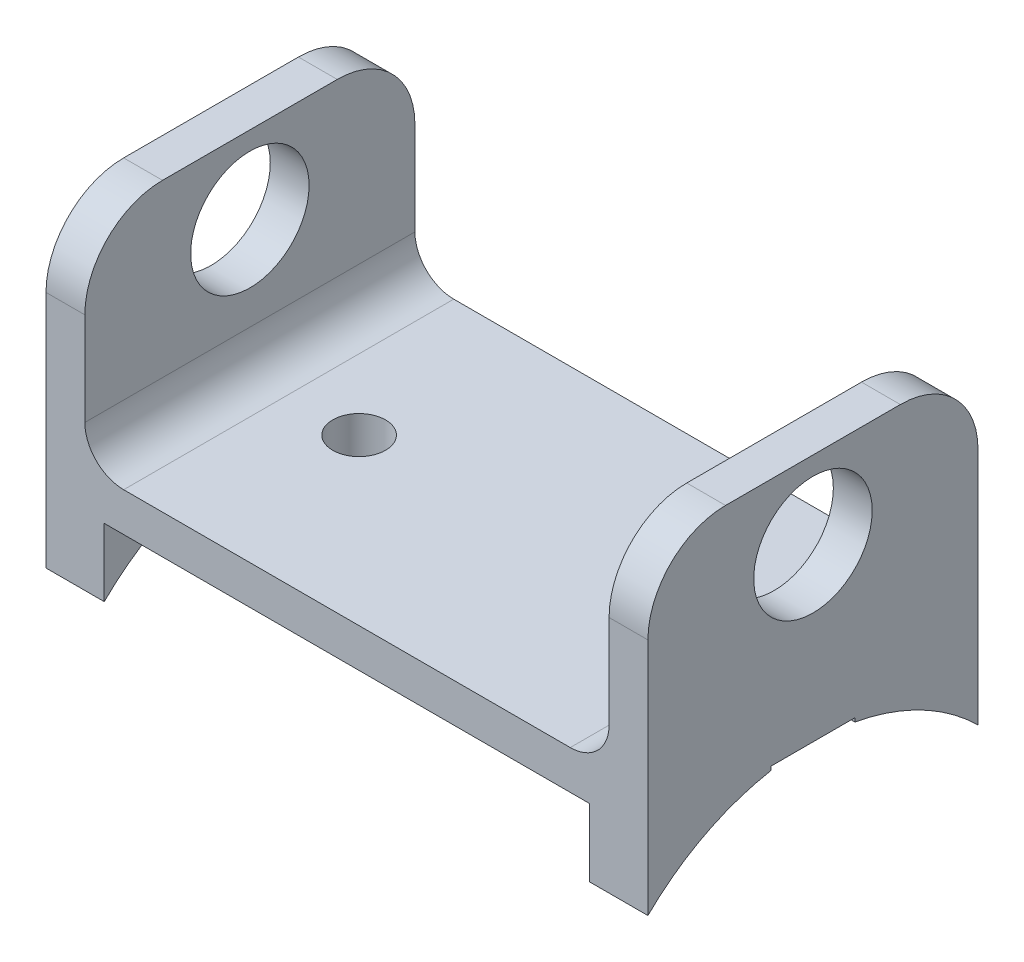
ISO-10303-21;
HEADER;
FILE_DESCRIPTION(('STEP AP214'),'2;1');
FILE_NAME('part.step','',(''),(''),'','','');
FILE_SCHEMA(('AUTOMOTIVE_DESIGN { 1 0 10303 214 1 1 1 1 }'));
ENDSEC;
DATA;
#1=APPLICATION_CONTEXT('core data for automotive mechanical design processes');
#2=APPLICATION_PROTOCOL_DEFINITION('international standard','automotive_design',2000,#1);
#3=PRODUCT_CONTEXT('',#1,'mechanical');
#4=PRODUCT('Part','Part','',(#3));
#5=PRODUCT_RELATED_PRODUCT_CATEGORY('part','',(#4));
#6=PRODUCT_DEFINITION_FORMATION('','',#4);
#7=PRODUCT_DEFINITION_CONTEXT('part definition',#1,'design');
#8=PRODUCT_DEFINITION('design','',#6,#7);
#9=PRODUCT_DEFINITION_SHAPE('','',#8);
#10=(LENGTH_UNIT() NAMED_UNIT(*) SI_UNIT(.MILLI.,.METRE.));
#11=(NAMED_UNIT(*) PLANE_ANGLE_UNIT() SI_UNIT($,.RADIAN.));
#12=(NAMED_UNIT(*) SI_UNIT($,.STERADIAN.) SOLID_ANGLE_UNIT());
#13=UNCERTAINTY_MEASURE_WITH_UNIT(LENGTH_MEASURE(1.E-05),#10,'distance_accuracy_value','');
#14=(GEOMETRIC_REPRESENTATION_CONTEXT(3) GLOBAL_UNCERTAINTY_ASSIGNED_CONTEXT((#13)) GLOBAL_UNIT_ASSIGNED_CONTEXT((#10,
#11,#12)) REPRESENTATION_CONTEXT('',''));
#15=CARTESIAN_POINT('',(0.,0.,0.));
#16=DIRECTION('',(0.,0.,1.));
#17=DIRECTION('',(1.,0.,0.));
#18=AXIS2_PLACEMENT_3D('',#15,#16,#17);
#19=CARTESIAN_POINT('',(-17.145,0.,-10.795));
#20=DIRECTION('',(0.,1.,0.));
#21=DIRECTION('',(0.,0.,1.));
#22=AXIS2_PLACEMENT_3D('',#19,#20,#21);
#23=PLANE('',#22);
#24=CARTESIAN_POINT('',(10.,0.,1.37910516340156E-13));
#25=DIRECTION('',(0.,1.,0.));
#26=DIRECTION('',(0.,0.,1.));
#27=AXIS2_PLACEMENT_3D('',#24,#25,#26);
#28=CIRCLE('',#27,1.7272);
#29=CARTESIAN_POINT('',(10.,0.,1.72720000000014));
#30=VERTEX_POINT('',#29);
#31=EDGE_CURVE('E428',#30,#30,#28,.T.);
#32=ORIENTED_EDGE('',*,*,#31,.T.);
#33=EDGE_LOOP('',(#32));
#34=FACE_BOUND('',#33,.T.);
#35=CARTESIAN_POINT('',(-10.,0.,1.40078920685127E-13));
#36=DIRECTION('',(0.,1.,0.));
#37=DIRECTION('',(0.,0.,1.));
#38=AXIS2_PLACEMENT_3D('',#35,#36,#37);
#39=CIRCLE('',#38,1.7272);
#40=CARTESIAN_POINT('',(-10.,0.,1.72720000000014));
#41=VERTEX_POINT('',#40);
#42=EDGE_CURVE('E437',#41,#41,#39,.T.);
#43=ORIENTED_EDGE('',*,*,#42,.T.);
#44=EDGE_LOOP('',(#43));
#45=FACE_BOUND('',#44,.T.);
#46=DIRECTION('',(1.,0.,0.));
#47=VECTOR('',#46,1.);
#48=CARTESIAN_POINT('',(15.875,0.,-2.74999999999998));
#49=LINE('',#48,#47);
#50=CARTESIAN_POINT('',(15.875,0.,-2.74999999999998));
#51=VERTEX_POINT('',#50);
#52=CARTESIAN_POINT('',(19.685,0.,-2.74999999999998));
#53=VERTEX_POINT('',#52);
#54=EDGE_CURVE('E228',#51,#53,#49,.T.);
#55=ORIENTED_EDGE('',*,*,#54,.T.);
#56=DIRECTION('',(0.,0.,-1.));
#57=VECTOR('',#56,1.);
#58=CARTESIAN_POINT('',(19.685,0.,10.795));
#59=LINE('',#58,#57);
#60=CARTESIAN_POINT('',(19.685,0.,2.74999999999998));
#61=VERTEX_POINT('',#60);
#62=EDGE_CURVE('E423',#61,#53,#59,.T.);
#63=ORIENTED_EDGE('',*,*,#62,.F.);
#64=DIRECTION('',(1.,0.,0.));
#65=VECTOR('',#64,1.);
#66=CARTESIAN_POINT('',(15.875,0.,2.74999999999998));
#67=LINE('',#66,#65);
#68=CARTESIAN_POINT('',(15.875,0.,2.74999999999998));
#69=VERTEX_POINT('',#68);
#70=EDGE_CURVE('E267',#69,#61,#67,.T.);
#71=ORIENTED_EDGE('',*,*,#70,.F.);
#72=DIRECTION('',(0.,0.,1.));
#73=VECTOR('',#72,1.);
#74=CARTESIAN_POINT('',(15.875,0.,10.795));
#75=LINE('',#74,#73);
#76=CARTESIAN_POINT('',(15.875,0.,10.795));
#77=VERTEX_POINT('',#76);
#78=EDGE_CURVE('E253',#69,#77,#75,.T.);
#79=ORIENTED_EDGE('',*,*,#78,.T.);
#80=DIRECTION('',(1.,0.,0.));
#81=VECTOR('',#80,1.);
#82=CARTESIAN_POINT('',(17.145,0.,10.795));
#83=LINE('',#82,#81);
#84=CARTESIAN_POINT('',(-15.875,0.,10.795));
#85=VERTEX_POINT('',#84);
#86=EDGE_CURVE('E442',#85,#77,#83,.T.);
#87=ORIENTED_EDGE('',*,*,#86,.F.);
#88=DIRECTION('',(0.,0.,1.));
#89=VECTOR('',#88,1.);
#90=CARTESIAN_POINT('',(-15.875,0.,10.795));
#91=LINE('',#90,#89);
#92=CARTESIAN_POINT('',(-15.875,0.,2.74999999999998));
#93=VERTEX_POINT('',#92);
#94=EDGE_CURVE('E277',#93,#85,#91,.T.);
#95=ORIENTED_EDGE('',*,*,#94,.F.);
#96=DIRECTION('',(-1.,0.,0.));
#97=VECTOR('',#96,1.);
#98=CARTESIAN_POINT('',(-15.875,0.,2.74999999999998));
#99=LINE('',#98,#97);
#100=CARTESIAN_POINT('',(-19.685,0.,2.74999999999998));
#101=VERTEX_POINT('',#100);
#102=EDGE_CURVE('E292',#93,#101,#99,.T.);
#103=ORIENTED_EDGE('',*,*,#102,.T.);
#104=DIRECTION('',(0.,0.,-1.));
#105=VECTOR('',#104,1.);
#106=CARTESIAN_POINT('',(-19.685,0.,10.795));
#107=LINE('',#106,#105);
#108=CARTESIAN_POINT('',(-19.685,0.,-2.74999999999998));
#109=VERTEX_POINT('',#108);
#110=EDGE_CURVE('E326',#101,#109,#107,.T.);
#111=ORIENTED_EDGE('',*,*,#110,.T.);
#112=DIRECTION('',(-1.,0.,0.));
#113=VECTOR('',#112,1.);
#114=CARTESIAN_POINT('',(-15.875,0.,-2.74999999999998));
#115=LINE('',#114,#113);
#116=CARTESIAN_POINT('',(-15.875,0.,-2.74999999999998));
#117=VERTEX_POINT('',#116);
#118=EDGE_CURVE('E315',#117,#109,#115,.T.);
#119=ORIENTED_EDGE('',*,*,#118,.F.);
#120=DIRECTION('',(0.,0.,-1.));
#121=VECTOR('',#120,1.);
#122=CARTESIAN_POINT('',(-15.875,0.,-10.795));
#123=LINE('',#122,#121);
#124=CARTESIAN_POINT('',(-15.875,0.,-10.795));
#125=VERTEX_POINT('',#124);
#126=EDGE_CURVE('E304',#117,#125,#123,.T.);
#127=ORIENTED_EDGE('',*,*,#126,.T.);
#128=DIRECTION('',(-1.,0.,0.));
#129=VECTOR('',#128,1.);
#130=CARTESIAN_POINT('',(17.145,0.,-10.795));
#131=LINE('',#130,#129);
#132=CARTESIAN_POINT('',(15.875,0.,-10.795));
#133=VERTEX_POINT('',#132);
#134=EDGE_CURVE('E331',#133,#125,#131,.T.);
#135=ORIENTED_EDGE('',*,*,#134,.F.);
#136=DIRECTION('',(0.,0.,-1.));
#137=VECTOR('',#136,1.);
#138=CARTESIAN_POINT('',(15.875,0.,-10.795));
#139=LINE('',#138,#137);
#140=EDGE_CURVE('E216',#51,#133,#139,.T.);
#141=ORIENTED_EDGE('',*,*,#140,.F.);
#142=EDGE_LOOP('',(#55,#63,#71,#79,#87,#95,#103,#111,#119,#127,#135,#141));
#143=FACE_BOUND('',#142,.T.);
#144=ADVANCED_FACE('F37',(#34,#45,#143),#23,.F.);
#145=CARTESIAN_POINT('',(-17.145,2.54,-10.795));
#146=DIRECTION('',(0.,1.,0.));
#147=DIRECTION('',(0.,0.,1.));
#148=AXIS2_PLACEMENT_3D('',#145,#146,#147);
#149=PLANE('',#148);
#150=CARTESIAN_POINT('',(-10.,2.54,1.40078920685127E-13));
#151=DIRECTION('',(0.,1.,0.));
#152=DIRECTION('',(0.,0.,1.));
#153=AXIS2_PLACEMENT_3D('',#150,#151,#152);
#154=CIRCLE('',#153,1.7272);
#155=CARTESIAN_POINT('',(-10.,2.54,1.72720000000014));
#156=VERTEX_POINT('',#155);
#157=EDGE_CURVE('E439',#156,#156,#154,.T.);
#158=ORIENTED_EDGE('',*,*,#157,.F.);
#159=EDGE_LOOP('',(#158));
#160=FACE_BOUND('',#159,.T.);
#161=DIRECTION('',(-1.,0.,0.));
#162=VECTOR('',#161,1.);
#163=CARTESIAN_POINT('',(17.145,2.54,-10.795));
#164=LINE('',#163,#162);
#165=CARTESIAN_POINT('',(14.605,2.54,-10.795));
#166=VERTEX_POINT('',#165);
#167=CARTESIAN_POINT('',(-14.605,2.54,-10.795));
#168=VERTEX_POINT('',#167);
#169=EDGE_CURVE('E391',#166,#168,#164,.T.);
#170=ORIENTED_EDGE('',*,*,#169,.T.);
#171=DIRECTION('',(0.,0.,1.));
#172=VECTOR('',#171,1.);
#173=CARTESIAN_POINT('',(-14.605,2.54,10.795));
#174=LINE('',#173,#172);
#175=CARTESIAN_POINT('',(-14.605,2.54,10.795));
#176=VERTEX_POINT('',#175);
#177=EDGE_CURVE('E403',#168,#176,#174,.T.);
#178=ORIENTED_EDGE('',*,*,#177,.T.);
#179=DIRECTION('',(1.,0.,0.));
#180=VECTOR('',#179,1.);
#181=CARTESIAN_POINT('',(17.145,2.54,10.795));
#182=LINE('',#181,#180);
#183=CARTESIAN_POINT('',(14.605,2.54,10.795));
#184=VERTEX_POINT('',#183);
#185=EDGE_CURVE('E408',#176,#184,#182,.T.);
#186=ORIENTED_EDGE('',*,*,#185,.T.);
#187=DIRECTION('',(0.,0.,-1.));
#188=VECTOR('',#187,1.);
#189=CARTESIAN_POINT('',(14.605,2.54,-10.795));
#190=LINE('',#189,#188);
#191=EDGE_CURVE('E406',#184,#166,#190,.T.);
#192=ORIENTED_EDGE('',*,*,#191,.T.);
#193=EDGE_LOOP('',(#170,#178,#186,#192));
#194=FACE_BOUND('',#193,.T.);
#195=CARTESIAN_POINT('',(10.,2.54,1.37910516340156E-13));
#196=DIRECTION('',(0.,1.,0.));
#197=DIRECTION('',(0.,0.,1.));
#198=AXIS2_PLACEMENT_3D('',#195,#196,#197);
#199=CIRCLE('',#198,1.7272);
#200=CARTESIAN_POINT('',(10.,2.54,1.72720000000014));
#201=VERTEX_POINT('',#200);
#202=EDGE_CURVE('E432',#201,#201,#199,.T.);
#203=ORIENTED_EDGE('',*,*,#202,.F.);
#204=EDGE_LOOP('',(#203));
#205=FACE_BOUND('',#204,.T.);
#206=ADVANCED_FACE('F400',(#160,#194,#205),#149,.T.);
#207=CARTESIAN_POINT('',(17.145,2.54,10.795));
#208=DIRECTION('',(0.,0.,-1.));
#209=DIRECTION('',(-1.,0.,0.));
#210=AXIS2_PLACEMENT_3D('',#207,#208,#209);
#211=PLANE('',#210);
#212=DIRECTION('',(0.,-1.,0.));
#213=VECTOR('',#212,1.);
#214=CARTESIAN_POINT('',(-17.145,0.,10.795));
#215=LINE('',#214,#213);
#216=CARTESIAN_POINT('',(-17.145,11.176,10.795));
#217=VERTEX_POINT('',#216);
#218=CARTESIAN_POINT('',(-17.145,5.08,10.795));
#219=VERTEX_POINT('',#218);
#220=EDGE_CURVE('E343',#217,#219,#215,.T.);
#221=ORIENTED_EDGE('',*,*,#220,.F.);
#222=DIRECTION('',(1.,0.,0.));
#223=VECTOR('',#222,1.);
#224=CARTESIAN_POINT('',(-19.685,11.176,10.795));
#225=LINE('',#224,#223);
#226=CARTESIAN_POINT('',(-19.685,11.176,10.795));
#227=VERTEX_POINT('',#226);
#228=EDGE_CURVE('E504',#217,#227,#225,.F.);
#229=ORIENTED_EDGE('',*,*,#228,.T.);
#230=DIRECTION('',(0.,-1.,0.));
#231=VECTOR('',#230,1.);
#232=CARTESIAN_POINT('',(-19.685,0.,10.795));
#233=LINE('',#232,#231);
#234=CARTESIAN_POINT('',(-19.685,-4.4371417584576,10.795));
#235=VERTEX_POINT('',#234);
#236=EDGE_CURVE('E414',#227,#235,#233,.T.);
#237=ORIENTED_EDGE('',*,*,#236,.T.);
#238=DIRECTION('',(-1.,0.,0.));
#239=VECTOR('',#238,1.);
#240=CARTESIAN_POINT('',(-15.875,-4.4371417584576,10.795));
#241=LINE('',#240,#239);
#242=CARTESIAN_POINT('',(-15.875,-4.4371417584576,10.795));
#243=VERTEX_POINT('',#242);
#244=EDGE_CURVE('E283',#243,#235,#241,.T.);
#245=ORIENTED_EDGE('',*,*,#244,.F.);
#246=DIRECTION('',(0.,-1.,0.));
#247=VECTOR('',#246,1.);
#248=CARTESIAN_POINT('',(-15.875,0.,10.795));
#249=LINE('',#248,#247);
#250=EDGE_CURVE('E274',#85,#243,#249,.T.);
#251=ORIENTED_EDGE('',*,*,#250,.F.);
#252=ORIENTED_EDGE('',*,*,#86,.T.);
#253=DIRECTION('',(0.,-1.,0.));
#254=VECTOR('',#253,1.);
#255=CARTESIAN_POINT('',(15.875,0.,10.795));
#256=LINE('',#255,#254);
#257=CARTESIAN_POINT('',(15.875,-4.4371417584576,10.795));
#258=VERTEX_POINT('',#257);
#259=EDGE_CURVE('E256',#77,#258,#256,.T.);
#260=ORIENTED_EDGE('',*,*,#259,.T.);
#261=DIRECTION('',(1.,0.,0.));
#262=VECTOR('',#261,1.);
#263=CARTESIAN_POINT('',(15.875,-4.4371417584576,10.795));
#264=LINE('',#263,#262);
#265=CARTESIAN_POINT('',(19.685,-4.4371417584576,10.795));
#266=VERTEX_POINT('',#265);
#267=EDGE_CURVE('E263',#258,#266,#264,.T.);
#268=ORIENTED_EDGE('',*,*,#267,.T.);
#269=DIRECTION('',(0.,-1.,0.));
#270=VECTOR('',#269,1.);
#271=CARTESIAN_POINT('',(19.685,0.,10.795));
#272=LINE('',#271,#270);
#273=CARTESIAN_POINT('',(19.685,11.176,10.795));
#274=VERTEX_POINT('',#273);
#275=EDGE_CURVE('E421',#274,#266,#272,.T.);
#276=ORIENTED_EDGE('',*,*,#275,.F.);
#277=DIRECTION('',(-1.,0.,0.));
#278=VECTOR('',#277,1.);
#279=CARTESIAN_POINT('',(17.145,11.176,10.795));
#280=LINE('',#279,#278);
#281=CARTESIAN_POINT('',(17.145,11.176,10.795));
#282=VERTEX_POINT('',#281);
#283=EDGE_CURVE('E363',#274,#282,#280,.T.);
#284=ORIENTED_EDGE('',*,*,#283,.T.);
#285=DIRECTION('',(0.,-1.,0.));
#286=VECTOR('',#285,1.);
#287=CARTESIAN_POINT('',(17.145,0.,10.795));
#288=LINE('',#287,#286);
#289=CARTESIAN_POINT('',(17.145,5.08,10.795));
#290=VERTEX_POINT('',#289);
#291=EDGE_CURVE('E364',#282,#290,#288,.T.);
#292=ORIENTED_EDGE('',*,*,#291,.T.);
#293=CARTESIAN_POINT('',(14.605,5.08,10.795));
#294=DIRECTION('',(0.,0.,-1.));
#295=DIRECTION('',(-1.,0.,0.));
#296=AXIS2_PLACEMENT_3D('',#293,#294,#295);
#297=CIRCLE('',#296,2.54);
#298=EDGE_CURVE('E12',#290,#184,#297,.T.);
#299=ORIENTED_EDGE('',*,*,#298,.T.);
#300=ORIENTED_EDGE('',*,*,#185,.F.);
#301=CARTESIAN_POINT('',(-14.605,5.08,10.795));
#302=DIRECTION('',(0.,0.,-1.));
#303=DIRECTION('',(-1.,0.,0.));
#304=AXIS2_PLACEMENT_3D('',#301,#302,#303);
#305=CIRCLE('',#304,2.54);
#306=EDGE_CURVE('E385',#176,#219,#305,.T.);
#307=ORIENTED_EDGE('',*,*,#306,.T.);
#308=EDGE_LOOP('',(#221,#229,#237,#245,#251,#252,#260,#268,#276,#284,#292,#299,#300,#307));
#309=FACE_BOUND('',#308,.T.);
#310=ADVANCED_FACE('F512',(#309),#211,.F.);
#311=CARTESIAN_POINT('',(17.145,2.54,-10.795));
#312=DIRECTION('',(0.,0.,1.));
#313=DIRECTION('',(1.,0.,0.));
#314=AXIS2_PLACEMENT_3D('',#311,#312,#313);
#315=PLANE('',#314);
#316=DIRECTION('',(0.,1.,0.));
#317=VECTOR('',#316,1.);
#318=CARTESIAN_POINT('',(-19.685,0.,-10.795));
#319=LINE('',#318,#317);
#320=CARTESIAN_POINT('',(-19.685,-4.4371417584576,-10.795));
#321=VERTEX_POINT('',#320);
#322=CARTESIAN_POINT('',(-19.685,11.176,-10.795));
#323=VERTEX_POINT('',#322);
#324=EDGE_CURVE('E330',#321,#323,#319,.T.);
#325=ORIENTED_EDGE('',*,*,#324,.T.);
#326=DIRECTION('',(1.,0.,0.));
#327=VECTOR('',#326,1.);
#328=CARTESIAN_POINT('',(-17.145,11.176,-10.795));
#329=LINE('',#328,#327);
#330=CARTESIAN_POINT('',(-17.145,11.176,-10.795));
#331=VERTEX_POINT('',#330);
#332=EDGE_CURVE('E348',#323,#331,#329,.T.);
#333=ORIENTED_EDGE('',*,*,#332,.T.);
#334=DIRECTION('',(0.,1.,0.));
#335=VECTOR('',#334,1.);
#336=CARTESIAN_POINT('',(-17.145,0.,-10.795));
#337=LINE('',#336,#335);
#338=CARTESIAN_POINT('',(-17.145,5.08,-10.795));
#339=VERTEX_POINT('',#338);
#340=EDGE_CURVE('E393',#339,#331,#337,.T.);
#341=ORIENTED_EDGE('',*,*,#340,.F.);
#342=CARTESIAN_POINT('',(-14.605,5.08,-10.795));
#343=DIRECTION('',(0.,0.,1.));
#344=DIRECTION('',(1.,0.,0.));
#345=AXIS2_PLACEMENT_3D('',#342,#343,#344);
#346=CIRCLE('',#345,2.54);
#347=EDGE_CURVE('E387',#339,#168,#346,.T.);
#348=ORIENTED_EDGE('',*,*,#347,.T.);
#349=ORIENTED_EDGE('',*,*,#169,.F.);
#350=CARTESIAN_POINT('',(14.605,5.08,-10.795));
#351=DIRECTION('',(0.,0.,1.));
#352=DIRECTION('',(1.,0.,0.));
#353=AXIS2_PLACEMENT_3D('',#350,#351,#352);
#354=CIRCLE('',#353,2.54);
#355=CARTESIAN_POINT('',(17.145,5.08,-10.795));
#356=VERTEX_POINT('',#355);
#357=EDGE_CURVE('E45',#166,#356,#354,.T.);
#358=ORIENTED_EDGE('',*,*,#357,.T.);
#359=DIRECTION('',(0.,1.,0.));
#360=VECTOR('',#359,1.);
#361=CARTESIAN_POINT('',(17.145,0.,-10.795));
#362=LINE('',#361,#360);
#363=CARTESIAN_POINT('',(17.145,11.176,-10.795));
#364=VERTEX_POINT('',#363);
#365=EDGE_CURVE('E367',#356,#364,#362,.T.);
#366=ORIENTED_EDGE('',*,*,#365,.T.);
#367=DIRECTION('',(-1.,0.,0.));
#368=VECTOR('',#367,1.);
#369=CARTESIAN_POINT('',(17.145,11.176,-10.795));
#370=LINE('',#369,#368);
#371=CARTESIAN_POINT('',(19.685,11.176,-10.795));
#372=VERTEX_POINT('',#371);
#373=EDGE_CURVE('E407',#364,#372,#370,.F.);
#374=ORIENTED_EDGE('',*,*,#373,.T.);
#375=DIRECTION('',(0.,1.,0.));
#376=VECTOR('',#375,1.);
#377=CARTESIAN_POINT('',(19.685,0.,-10.795));
#378=LINE('',#377,#376);
#379=CARTESIAN_POINT('',(19.685,-4.4371417584576,-10.795));
#380=VERTEX_POINT('',#379);
#381=EDGE_CURVE('E224',#380,#372,#378,.T.);
#382=ORIENTED_EDGE('',*,*,#381,.F.);
#383=DIRECTION('',(1.,0.,0.));
#384=VECTOR('',#383,1.);
#385=CARTESIAN_POINT('',(15.875,-4.4371417584576,-10.795));
#386=LINE('',#385,#384);
#387=CARTESIAN_POINT('',(15.875,-4.4371417584576,-10.795));
#388=VERTEX_POINT('',#387);
#389=EDGE_CURVE('E220',#388,#380,#386,.T.);
#390=ORIENTED_EDGE('',*,*,#389,.F.);
#391=DIRECTION('',(0.,-1.,0.));
#392=VECTOR('',#391,1.);
#393=CARTESIAN_POINT('',(15.875,0.,-10.795));
#394=LINE('',#393,#392);
#395=EDGE_CURVE('E209',#133,#388,#394,.T.);
#396=ORIENTED_EDGE('',*,*,#395,.F.);
#397=ORIENTED_EDGE('',*,*,#134,.T.);
#398=DIRECTION('',(0.,-1.,0.));
#399=VECTOR('',#398,1.);
#400=CARTESIAN_POINT('',(-15.875,0.,-10.795));
#401=LINE('',#400,#399);
#402=CARTESIAN_POINT('',(-15.875,-4.4371417584576,-10.795));
#403=VERTEX_POINT('',#402);
#404=EDGE_CURVE('E312',#125,#403,#401,.T.);
#405=ORIENTED_EDGE('',*,*,#404,.T.);
#406=DIRECTION('',(-1.,0.,0.));
#407=VECTOR('',#406,1.);
#408=CARTESIAN_POINT('',(-15.875,-4.4371417584576,-10.795));
#409=LINE('',#408,#407);
#410=EDGE_CURVE('E318',#403,#321,#409,.T.);
#411=ORIENTED_EDGE('',*,*,#410,.T.);
#412=EDGE_LOOP('',(#325,#333,#341,#348,#349,#358,#366,#374,#382,#390,#396,#397,#405,#411));
#413=FACE_BOUND('',#412,.T.);
#414=ADVANCED_FACE('F222',(#413),#315,.F.);
#415=CARTESIAN_POINT('',(-10.,2.54,1.40078920685127E-13));
#416=DIRECTION('',(0.,-1.,0.));
#417=DIRECTION('',(0.,0.,-1.));
#418=AXIS2_PLACEMENT_3D('',#415,#416,#417);
#419=CYLINDRICAL_SURFACE('',#418,1.7272);
#420=ORIENTED_EDGE('',*,*,#157,.T.);
#421=EDGE_LOOP('',(#420));
#422=FACE_BOUND('',#421,.T.);
#423=ORIENTED_EDGE('',*,*,#42,.F.);
#424=EDGE_LOOP('',(#423));
#425=FACE_BOUND('',#424,.T.);
#426=ADVANCED_FACE('F558',(#422,#425),#419,.F.);
#427=CARTESIAN_POINT('',(10.,2.54,1.37910516340156E-13));
#428=DIRECTION('',(0.,-1.,0.));
#429=DIRECTION('',(0.,0.,-1.));
#430=AXIS2_PLACEMENT_3D('',#427,#428,#429);
#431=CYLINDRICAL_SURFACE('',#430,1.7272);
#432=ORIENTED_EDGE('',*,*,#202,.T.);
#433=EDGE_LOOP('',(#432));
#434=FACE_BOUND('',#433,.T.);
#435=ORIENTED_EDGE('',*,*,#31,.F.);
#436=EDGE_LOOP('',(#435));
#437=FACE_BOUND('',#436,.T.);
#438=ADVANCED_FACE('F637',(#434,#437),#431,.F.);
#439=CARTESIAN_POINT('',(17.145,16.256,10.795));
#440=DIRECTION('',(-1.,0.,0.));
#441=DIRECTION('',(0.,0.,1.));
#442=AXIS2_PLACEMENT_3D('',#439,#440,#441);
#443=PLANE('',#442);
#444=CARTESIAN_POINT('',(17.145,11.176,0.));
#445=DIRECTION('',(1.,0.,0.));
#446=DIRECTION('',(0.,0.,-1.));
#447=AXIS2_PLACEMENT_3D('',#444,#445,#446);
#448=CIRCLE('',#447,3.8735);
#449=CARTESIAN_POINT('',(17.145,11.176,-3.8735));
#450=VERTEX_POINT('',#449);
#451=EDGE_CURVE('E329',#450,#450,#448,.T.);
#452=ORIENTED_EDGE('',*,*,#451,.T.);
#453=EDGE_LOOP('',(#452));
#454=FACE_BOUND('',#453,.T.);
#455=ORIENTED_EDGE('',*,*,#365,.F.);
#456=DIRECTION('',(0.,0.,-1.));
#457=VECTOR('',#456,1.);
#458=CARTESIAN_POINT('',(17.145,5.08,10.795));
#459=LINE('',#458,#457);
#460=EDGE_CURVE('E58',#356,#290,#459,.F.);
#461=ORIENTED_EDGE('',*,*,#460,.T.);
#462=ORIENTED_EDGE('',*,*,#291,.F.);
#463=CARTESIAN_POINT('',(17.145,11.176,5.715));
#464=DIRECTION('',(-1.,0.,0.));
#465=DIRECTION('',(0.,0.,1.));
#466=AXIS2_PLACEMENT_3D('',#463,#464,#465);
#467=CIRCLE('',#466,5.08);
#468=CARTESIAN_POINT('',(17.145,16.256,5.715));
#469=VERTEX_POINT('',#468);
#470=EDGE_CURVE('E502',#282,#469,#467,.T.);
#471=ORIENTED_EDGE('',*,*,#470,.T.);
#472=DIRECTION('',(0.,0.,1.));
#473=VECTOR('',#472,1.);
#474=CARTESIAN_POINT('',(17.145,16.256,10.795));
#475=LINE('',#474,#473);
#476=CARTESIAN_POINT('',(17.145,16.256,-5.715));
#477=VERTEX_POINT('',#476);
#478=EDGE_CURVE('E377',#477,#469,#475,.T.);
#479=ORIENTED_EDGE('',*,*,#478,.F.);
#480=CARTESIAN_POINT('',(17.145,11.176,-5.715));
#481=DIRECTION('',(-1.,0.,0.));
#482=DIRECTION('',(0.,0.,1.));
#483=AXIS2_PLACEMENT_3D('',#480,#481,#482);
#484=CIRCLE('',#483,5.08);
#485=EDGE_CURVE('E492',#477,#364,#484,.T.);
#486=ORIENTED_EDGE('',*,*,#485,.T.);
#487=EDGE_LOOP('',(#455,#461,#462,#471,#479,#486));
#488=FACE_BOUND('',#487,.T.);
#489=ADVANCED_FACE('F515',(#454,#488),#443,.T.);
#490=CARTESIAN_POINT('',(19.685,16.256,10.795));
#491=DIRECTION('',(-1.,0.,0.));
#492=DIRECTION('',(0.,0.,1.));
#493=AXIS2_PLACEMENT_3D('',#490,#491,#492);
#494=PLANE('',#493);
#495=DIRECTION('',(0.,0.,1.));
#496=VECTOR('',#495,1.);
#497=CARTESIAN_POINT('',(19.685,16.256,10.795));
#498=LINE('',#497,#496);
#499=CARTESIAN_POINT('',(19.685,16.256,-5.715));
#500=VERTEX_POINT('',#499);
#501=CARTESIAN_POINT('',(19.685,16.256,5.715));
#502=VERTEX_POINT('',#501);
#503=EDGE_CURVE('E373',#500,#502,#498,.T.);
#504=ORIENTED_EDGE('',*,*,#503,.T.);
#505=CARTESIAN_POINT('',(19.685,11.176,5.715));
#506=DIRECTION('',(-1.,0.,0.));
#507=DIRECTION('',(0.,0.,1.));
#508=AXIS2_PLACEMENT_3D('',#505,#506,#507);
#509=CIRCLE('',#508,5.08);
#510=EDGE_CURVE('E412',#502,#274,#509,.F.);
#511=ORIENTED_EDGE('',*,*,#510,.T.);
#512=ORIENTED_EDGE('',*,*,#275,.T.);
#513=CARTESIAN_POINT('',(19.685,-15.35,0.));
#514=DIRECTION('',(-1.,0.,0.));
#515=DIRECTION('',(0.,0.,-1.));
#516=AXIS2_PLACEMENT_3D('',#513,#514,#515);
#517=CIRCLE('',#516,15.35);
#518=CARTESIAN_POINT('',(19.685,-0.248344461616135,2.74999999999999));
#519=VERTEX_POINT('',#518);
#520=EDGE_CURVE('E243',#266,#519,#517,.T.);
#521=ORIENTED_EDGE('',*,*,#520,.T.);
#522=DIRECTION('',(0.,1.,0.));
#523=VECTOR('',#522,1.);
#524=CARTESIAN_POINT('',(19.685,-0.248344461616135,2.74999999999999));
#525=LINE('',#524,#523);
#526=EDGE_CURVE('E250',#519,#61,#525,.T.);
#527=ORIENTED_EDGE('',*,*,#526,.T.);
#528=ORIENTED_EDGE('',*,*,#62,.T.);
#529=DIRECTION('',(0.,1.,0.));
#530=VECTOR('',#529,1.);
#531=CARTESIAN_POINT('',(19.685,-0.248344461616135,-2.74999999999999));
#532=LINE('',#531,#530);
#533=CARTESIAN_POINT('',(19.685,-0.248344461616135,-2.74999999999999));
#534=VERTEX_POINT('',#533);
#535=EDGE_CURVE('E234',#534,#53,#532,.T.);
#536=ORIENTED_EDGE('',*,*,#535,.F.);
#537=CARTESIAN_POINT('',(19.685,-15.35,0.));
#538=DIRECTION('',(1.,0.,0.));
#539=DIRECTION('',(0.,0.,1.));
#540=AXIS2_PLACEMENT_3D('',#537,#538,#539);
#541=CIRCLE('',#540,15.35);
#542=EDGE_CURVE('E236',#380,#534,#541,.T.);
#543=ORIENTED_EDGE('',*,*,#542,.F.);
#544=ORIENTED_EDGE('',*,*,#381,.T.);
#545=CARTESIAN_POINT('',(19.685,11.176,-5.715));
#546=DIRECTION('',(-1.,0.,0.));
#547=DIRECTION('',(0.,0.,1.));
#548=AXIS2_PLACEMENT_3D('',#545,#546,#547);
#549=CIRCLE('',#548,5.08);
#550=EDGE_CURVE('E494',#372,#500,#549,.F.);
#551=ORIENTED_EDGE('',*,*,#550,.T.);
#552=EDGE_LOOP('',(#504,#511,#512,#521,#527,#528,#536,#543,#544,#551));
#553=FACE_BOUND('',#552,.T.);
#554=CARTESIAN_POINT('',(19.685,11.176,0.));
#555=DIRECTION('',(1.,0.,0.));
#556=DIRECTION('',(0.,0.,-1.));
#557=AXIS2_PLACEMENT_3D('',#554,#555,#556);
#558=CIRCLE('',#557,3.8735);
#559=CARTESIAN_POINT('',(19.685,11.176,-3.8735));
#560=VERTEX_POINT('',#559);
#561=EDGE_CURVE('E368',#560,#560,#558,.T.);
#562=ORIENTED_EDGE('',*,*,#561,.F.);
#563=EDGE_LOOP('',(#562));
#564=FACE_BOUND('',#563,.T.);
#565=ADVANCED_FACE('F522',(#553,#564),#494,.F.);
#566=CARTESIAN_POINT('',(19.685,16.256,10.795));
#567=DIRECTION('',(0.,-1.,0.));
#568=DIRECTION('',(0.,0.,-1.));
#569=AXIS2_PLACEMENT_3D('',#566,#567,#568);
#570=PLANE('',#569);
#571=ORIENTED_EDGE('',*,*,#478,.T.);
#572=DIRECTION('',(-1.,0.,0.));
#573=VECTOR('',#572,1.);
#574=CARTESIAN_POINT('',(19.685,16.256,5.715));
#575=LINE('',#574,#573);
#576=EDGE_CURVE('E496',#469,#502,#575,.F.);
#577=ORIENTED_EDGE('',*,*,#576,.T.);
#578=ORIENTED_EDGE('',*,*,#503,.F.);
#579=DIRECTION('',(-1.,0.,0.));
#580=VECTOR('',#579,1.);
#581=CARTESIAN_POINT('',(19.685,16.256,-5.715));
#582=LINE('',#581,#580);
#583=EDGE_CURVE('E495',#500,#477,#582,.T.);
#584=ORIENTED_EDGE('',*,*,#583,.T.);
#585=EDGE_LOOP('',(#571,#577,#578,#584));
#586=FACE_BOUND('',#585,.T.);
#587=ADVANCED_FACE('F520',(#586),#570,.F.);
#588=CARTESIAN_POINT('',(19.685,11.176,0.));
#589=DIRECTION('',(-1.,0.,0.));
#590=DIRECTION('',(0.,0.,1.));
#591=AXIS2_PLACEMENT_3D('',#588,#589,#590);
#592=CYLINDRICAL_SURFACE('',#591,3.8735);
#593=ORIENTED_EDGE('',*,*,#561,.T.);
#594=EDGE_LOOP('',(#593));
#595=FACE_BOUND('',#594,.T.);
#596=ORIENTED_EDGE('',*,*,#451,.F.);
#597=EDGE_LOOP('',(#596));
#598=FACE_BOUND('',#597,.T.);
#599=ADVANCED_FACE('F626',(#595,#598),#592,.F.);
#600=CARTESIAN_POINT('',(-17.145,16.256,10.795));
#601=DIRECTION('',(1.,0.,0.));
#602=DIRECTION('',(0.,0.,1.));
#603=AXIS2_PLACEMENT_3D('',#600,#601,#602);
#604=PLANE('',#603);
#605=CARTESIAN_POINT('',(-17.145,11.176,0.));
#606=DIRECTION('',(1.,0.,0.));
#607=DIRECTION('',(0.,0.,-1.));
#608=AXIS2_PLACEMENT_3D('',#605,#606,#607);
#609=CIRCLE('',#608,3.8735);
#610=CARTESIAN_POINT('',(-17.145,11.176,-3.8735));
#611=VERTEX_POINT('',#610);
#612=EDGE_CURVE('E474',#611,#611,#609,.T.);
#613=ORIENTED_EDGE('',*,*,#612,.F.);
#614=EDGE_LOOP('',(#613));
#615=FACE_BOUND('',#614,.T.);
#616=ORIENTED_EDGE('',*,*,#220,.T.);
#617=DIRECTION('',(0.,0.,1.));
#618=VECTOR('',#617,1.);
#619=CARTESIAN_POINT('',(-17.145,5.08,-10.795));
#620=LINE('',#619,#618);
#621=EDGE_CURVE('E382',#219,#339,#620,.F.);
#622=ORIENTED_EDGE('',*,*,#621,.T.);
#623=ORIENTED_EDGE('',*,*,#340,.T.);
#624=CARTESIAN_POINT('',(-17.145,11.176,-5.715));
#625=DIRECTION('',(1.,0.,0.));
#626=DIRECTION('',(0.,0.,-1.));
#627=AXIS2_PLACEMENT_3D('',#624,#625,#626);
#628=CIRCLE('',#627,5.08);
#629=CARTESIAN_POINT('',(-17.145,16.256,-5.715));
#630=VERTEX_POINT('',#629);
#631=EDGE_CURVE('E352',#331,#630,#628,.T.);
#632=ORIENTED_EDGE('',*,*,#631,.T.);
#633=DIRECTION('',(0.,0.,1.));
#634=VECTOR('',#633,1.);
#635=CARTESIAN_POINT('',(-17.145,16.256,10.795));
#636=LINE('',#635,#634);
#637=CARTESIAN_POINT('',(-17.145,16.256,5.715));
#638=VERTEX_POINT('',#637);
#639=EDGE_CURVE('E340',#630,#638,#636,.T.);
#640=ORIENTED_EDGE('',*,*,#639,.T.);
#641=CARTESIAN_POINT('',(-17.145,11.176,5.715));
#642=DIRECTION('',(1.,0.,0.));
#643=DIRECTION('',(0.,0.,-1.));
#644=AXIS2_PLACEMENT_3D('',#641,#642,#643);
#645=CIRCLE('',#644,5.08);
#646=EDGE_CURVE('E350',#638,#217,#645,.T.);
#647=ORIENTED_EDGE('',*,*,#646,.T.);
#648=EDGE_LOOP('',(#616,#622,#623,#632,#640,#647));
#649=FACE_BOUND('',#648,.T.);
#650=ADVANCED_FACE('F579',(#615,#649),#604,.T.);
#651=CARTESIAN_POINT('',(-19.685,16.256,10.795));
#652=DIRECTION('',(0.,1.,0.));
#653=DIRECTION('',(0.,0.,1.));
#654=AXIS2_PLACEMENT_3D('',#651,#652,#653);
#655=PLANE('',#654);
#656=ORIENTED_EDGE('',*,*,#639,.F.);
#657=DIRECTION('',(1.,0.,0.));
#658=VECTOR('',#657,1.);
#659=CARTESIAN_POINT('',(-19.685,16.256,-5.715));
#660=LINE('',#659,#658);
#661=CARTESIAN_POINT('',(-19.685,16.256,-5.715));
#662=VERTEX_POINT('',#661);
#663=EDGE_CURVE('E357',#630,#662,#660,.F.);
#664=ORIENTED_EDGE('',*,*,#663,.T.);
#665=DIRECTION('',(0.,0.,1.));
#666=VECTOR('',#665,1.);
#667=CARTESIAN_POINT('',(-19.685,16.256,10.795));
#668=LINE('',#667,#666);
#669=CARTESIAN_POINT('',(-19.685,16.256,5.715));
#670=VERTEX_POINT('',#669);
#671=EDGE_CURVE('E477',#662,#670,#668,.T.);
#672=ORIENTED_EDGE('',*,*,#671,.T.);
#673=DIRECTION('',(1.,0.,0.));
#674=VECTOR('',#673,1.);
#675=CARTESIAN_POINT('',(-17.145,16.256,5.715));
#676=LINE('',#675,#674);
#677=EDGE_CURVE('E354',#670,#638,#676,.T.);
#678=ORIENTED_EDGE('',*,*,#677,.T.);
#679=EDGE_LOOP('',(#656,#664,#672,#678));
#680=FACE_BOUND('',#679,.T.);
#681=ADVANCED_FACE('F583',(#680),#655,.T.);
#682=CARTESIAN_POINT('',(-19.685,16.256,10.795));
#683=DIRECTION('',(1.,0.,0.));
#684=DIRECTION('',(0.,0.,1.));
#685=AXIS2_PLACEMENT_3D('',#682,#683,#684);
#686=PLANE('',#685);
#687=CARTESIAN_POINT('',(-19.685,11.176,0.));
#688=DIRECTION('',(1.,0.,0.));
#689=DIRECTION('',(0.,0.,-1.));
#690=AXIS2_PLACEMENT_3D('',#687,#688,#689);
#691=CIRCLE('',#690,3.8735);
#692=CARTESIAN_POINT('',(-19.685,11.176,-3.8735));
#693=VERTEX_POINT('',#692);
#694=EDGE_CURVE('E347',#693,#693,#691,.T.);
#695=ORIENTED_EDGE('',*,*,#694,.T.);
#696=EDGE_LOOP('',(#695));
#697=FACE_BOUND('',#696,.T.);
#698=ORIENTED_EDGE('',*,*,#671,.F.);
#699=CARTESIAN_POINT('',(-19.685,11.176,-5.715));
#700=DIRECTION('',(1.,0.,0.));
#701=DIRECTION('',(0.,0.,-1.));
#702=AXIS2_PLACEMENT_3D('',#699,#700,#701);
#703=CIRCLE('',#702,5.08);
#704=EDGE_CURVE('E361',#662,#323,#703,.F.);
#705=ORIENTED_EDGE('',*,*,#704,.T.);
#706=ORIENTED_EDGE('',*,*,#324,.F.);
#707=CARTESIAN_POINT('',(-19.685,-15.35,0.));
#708=DIRECTION('',(1.,0.,0.));
#709=DIRECTION('',(0.,0.,1.));
#710=AXIS2_PLACEMENT_3D('',#707,#708,#709);
#711=CIRCLE('',#710,15.35);
#712=CARTESIAN_POINT('',(-19.685,-0.248344461616135,-2.74999999999999));
#713=VERTEX_POINT('',#712);
#714=EDGE_CURVE('E291',#321,#713,#711,.T.);
#715=ORIENTED_EDGE('',*,*,#714,.T.);
#716=DIRECTION('',(0.,1.,0.));
#717=VECTOR('',#716,1.);
#718=CARTESIAN_POINT('',(-19.685,-0.248344461616135,-2.74999999999999));
#719=LINE('',#718,#717);
#720=EDGE_CURVE('E301',#713,#109,#719,.T.);
#721=ORIENTED_EDGE('',*,*,#720,.T.);
#722=ORIENTED_EDGE('',*,*,#110,.F.);
#723=DIRECTION('',(0.,1.,0.));
#724=VECTOR('',#723,1.);
#725=CARTESIAN_POINT('',(-19.685,-0.248344461616135,2.74999999999999));
#726=LINE('',#725,#724);
#727=CARTESIAN_POINT('',(-19.685,-0.248344461616135,2.74999999999999));
#728=VERTEX_POINT('',#727);
#729=EDGE_CURVE('E275',#728,#101,#726,.T.);
#730=ORIENTED_EDGE('',*,*,#729,.F.);
#731=CARTESIAN_POINT('',(-19.685,-15.35,0.));
#732=DIRECTION('',(-1.,0.,0.));
#733=DIRECTION('',(0.,0.,-1.));
#734=AXIS2_PLACEMENT_3D('',#731,#732,#733);
#735=CIRCLE('',#734,15.35);
#736=EDGE_CURVE('E266',#235,#728,#735,.T.);
#737=ORIENTED_EDGE('',*,*,#736,.F.);
#738=ORIENTED_EDGE('',*,*,#236,.F.);
#739=CARTESIAN_POINT('',(-19.685,11.176,5.715));
#740=DIRECTION('',(1.,0.,0.));
#741=DIRECTION('',(0.,0.,-1.));
#742=AXIS2_PLACEMENT_3D('',#739,#740,#741);
#743=CIRCLE('',#742,5.08);
#744=EDGE_CURVE('E359',#227,#670,#743,.F.);
#745=ORIENTED_EDGE('',*,*,#744,.T.);
#746=EDGE_LOOP('',(#698,#705,#706,#715,#721,#722,#730,#737,#738,#745));
#747=FACE_BOUND('',#746,.T.);
#748=ADVANCED_FACE('F466',(#697,#747),#686,.F.);
#749=CARTESIAN_POINT('',(-19.685,11.176,0.));
#750=DIRECTION('',(1.,0.,0.));
#751=DIRECTION('',(0.,0.,-1.));
#752=AXIS2_PLACEMENT_3D('',#749,#750,#751);
#753=CYLINDRICAL_SURFACE('',#752,3.8735);
#754=ORIENTED_EDGE('',*,*,#694,.F.);
#755=EDGE_LOOP('',(#754));
#756=FACE_BOUND('',#755,.T.);
#757=ORIENTED_EDGE('',*,*,#612,.T.);
#758=EDGE_LOOP('',(#757));
#759=FACE_BOUND('',#758,.T.);
#760=ADVANCED_FACE('F564',(#756,#759),#753,.F.);
#761=CARTESIAN_POINT('',(17.145,11.176,-5.715));
#762=DIRECTION('',(-1.,0.,0.));
#763=DIRECTION('',(0.,0.,1.));
#764=AXIS2_PLACEMENT_3D('',#761,#762,#763);
#765=CYLINDRICAL_SURFACE('',#764,5.08);
#766=ORIENTED_EDGE('',*,*,#704,.F.);
#767=ORIENTED_EDGE('',*,*,#663,.F.);
#768=ORIENTED_EDGE('',*,*,#631,.F.);
#769=ORIENTED_EDGE('',*,*,#332,.F.);
#770=EDGE_LOOP('',(#766,#767,#768,#769));
#771=FACE_BOUND('',#770,.T.);
#772=ADVANCED_FACE('F485',(#771),#765,.T.);
#773=CARTESIAN_POINT('',(-19.685,11.176,5.715));
#774=DIRECTION('',(-1.,0.,0.));
#775=DIRECTION('',(0.,0.,1.));
#776=AXIS2_PLACEMENT_3D('',#773,#774,#775);
#777=CYLINDRICAL_SURFACE('',#776,5.08);
#778=ORIENTED_EDGE('',*,*,#744,.F.);
#779=ORIENTED_EDGE('',*,*,#228,.F.);
#780=ORIENTED_EDGE('',*,*,#646,.F.);
#781=ORIENTED_EDGE('',*,*,#677,.F.);
#782=EDGE_LOOP('',(#778,#779,#780,#781));
#783=FACE_BOUND('',#782,.T.);
#784=ADVANCED_FACE('F563',(#783),#777,.T.);
#785=CARTESIAN_POINT('',(17.145,11.176,5.715));
#786=DIRECTION('',(-1.,0.,0.));
#787=DIRECTION('',(0.,0.,1.));
#788=AXIS2_PLACEMENT_3D('',#785,#786,#787);
#789=CYLINDRICAL_SURFACE('',#788,5.08);
#790=ORIENTED_EDGE('',*,*,#510,.F.);
#791=ORIENTED_EDGE('',*,*,#576,.F.);
#792=ORIENTED_EDGE('',*,*,#470,.F.);
#793=ORIENTED_EDGE('',*,*,#283,.F.);
#794=EDGE_LOOP('',(#790,#791,#792,#793));
#795=FACE_BOUND('',#794,.T.);
#796=ADVANCED_FACE('F521',(#795),#789,.T.);
#797=CARTESIAN_POINT('',(19.685,11.176,-5.715));
#798=DIRECTION('',(-1.,0.,0.));
#799=DIRECTION('',(0.,0.,1.));
#800=AXIS2_PLACEMENT_3D('',#797,#798,#799);
#801=CYLINDRICAL_SURFACE('',#800,5.08);
#802=ORIENTED_EDGE('',*,*,#550,.F.);
#803=ORIENTED_EDGE('',*,*,#373,.F.);
#804=ORIENTED_EDGE('',*,*,#485,.F.);
#805=ORIENTED_EDGE('',*,*,#583,.F.);
#806=EDGE_LOOP('',(#802,#803,#804,#805));
#807=FACE_BOUND('',#806,.T.);
#808=ADVANCED_FACE('F490',(#807),#801,.T.);
#809=CARTESIAN_POINT('',(-15.875,-15.35,0.));
#810=DIRECTION('',(-1.,0.,0.));
#811=DIRECTION('',(0.,0.,1.));
#812=AXIS2_PLACEMENT_3D('',#809,#810,#811);
#813=CYLINDRICAL_SURFACE('',#812,15.35);
#814=ORIENTED_EDGE('',*,*,#714,.F.);
#815=ORIENTED_EDGE('',*,*,#410,.F.);
#816=CARTESIAN_POINT('',(-15.875,-15.35,0.));
#817=DIRECTION('',(1.,0.,0.));
#818=DIRECTION('',(0.,0.,1.));
#819=AXIS2_PLACEMENT_3D('',#816,#817,#818);
#820=CIRCLE('',#819,15.35);
#821=CARTESIAN_POINT('',(-15.875,-0.248344461616135,-2.74999999999999));
#822=VERTEX_POINT('',#821);
#823=EDGE_CURVE('E297',#403,#822,#820,.T.);
#824=ORIENTED_EDGE('',*,*,#823,.T.);
#825=DIRECTION('',(-1.,0.,0.));
#826=VECTOR('',#825,1.);
#827=CARTESIAN_POINT('',(-15.875,-0.248344461616135,-2.74999999999999));
#828=LINE('',#827,#826);
#829=EDGE_CURVE('E319',#822,#713,#828,.T.);
#830=ORIENTED_EDGE('',*,*,#829,.T.);
#831=EDGE_LOOP('',(#814,#815,#824,#830));
#832=FACE_BOUND('',#831,.T.);
#833=ADVANCED_FACE('F469',(#832),#813,.F.);
#834=CARTESIAN_POINT('',(-15.875,-0.248344461616135,-2.74999999999999));
#835=DIRECTION('',(0.,0.,1.));
#836=DIRECTION('',(0.,-1.,0.));
#837=AXIS2_PLACEMENT_3D('',#834,#835,#836);
#838=PLANE('',#837);
#839=ORIENTED_EDGE('',*,*,#720,.F.);
#840=ORIENTED_EDGE('',*,*,#829,.F.);
#841=DIRECTION('',(0.,1.,0.));
#842=VECTOR('',#841,1.);
#843=CARTESIAN_POINT('',(-15.875,-0.248344461616135,-2.74999999999999));
#844=LINE('',#843,#842);
#845=EDGE_CURVE('E300',#822,#117,#844,.T.);
#846=ORIENTED_EDGE('',*,*,#845,.T.);
#847=ORIENTED_EDGE('',*,*,#118,.T.);
#848=EDGE_LOOP('',(#839,#840,#846,#847));
#849=FACE_BOUND('',#848,.T.);
#850=ADVANCED_FACE('F462',(#849),#838,.T.);
#851=CARTESIAN_POINT('',(-15.875,-15.35,0.));
#852=DIRECTION('',(-1.,0.,0.));
#853=DIRECTION('',(0.,0.,1.));
#854=AXIS2_PLACEMENT_3D('',#851,#852,#853);
#855=PLANE('',#854);
#856=ORIENTED_EDGE('',*,*,#823,.F.);
#857=ORIENTED_EDGE('',*,*,#404,.F.);
#858=ORIENTED_EDGE('',*,*,#126,.F.);
#859=ORIENTED_EDGE('',*,*,#845,.F.);
#860=EDGE_LOOP('',(#856,#857,#858,#859));
#861=FACE_BOUND('',#860,.T.);
#862=ADVANCED_FACE('F457',(#861),#855,.F.);
#863=CARTESIAN_POINT('',(-15.875,-15.35,0.));
#864=DIRECTION('',(-1.,0.,0.));
#865=DIRECTION('',(0.,0.,1.));
#866=AXIS2_PLACEMENT_3D('',#863,#864,#865);
#867=CYLINDRICAL_SURFACE('',#866,15.35);
#868=ORIENTED_EDGE('',*,*,#736,.T.);
#869=DIRECTION('',(-1.,0.,0.));
#870=VECTOR('',#869,1.);
#871=CARTESIAN_POINT('',(-15.875,-0.248344461616135,2.74999999999999));
#872=LINE('',#871,#870);
#873=CARTESIAN_POINT('',(-15.875,-0.248344461616135,2.74999999999999));
#874=VERTEX_POINT('',#873);
#875=EDGE_CURVE('E288',#874,#728,#872,.T.);
#876=ORIENTED_EDGE('',*,*,#875,.F.);
#877=CARTESIAN_POINT('',(-15.875,-15.35,0.));
#878=DIRECTION('',(-1.,0.,0.));
#879=DIRECTION('',(0.,0.,-1.));
#880=AXIS2_PLACEMENT_3D('',#877,#878,#879);
#881=CIRCLE('',#880,15.35);
#882=EDGE_CURVE('E271',#243,#874,#881,.T.);
#883=ORIENTED_EDGE('',*,*,#882,.F.);
#884=ORIENTED_EDGE('',*,*,#244,.T.);
#885=EDGE_LOOP('',(#868,#876,#883,#884));
#886=FACE_BOUND('',#885,.T.);
#887=ADVANCED_FACE('F589',(#886),#867,.F.);
#888=CARTESIAN_POINT('',(-15.875,-0.248344461616135,2.74999999999999));
#889=DIRECTION('',(0.,0.,1.));
#890=DIRECTION('',(0.,-1.,0.));
#891=AXIS2_PLACEMENT_3D('',#888,#889,#890);
#892=PLANE('',#891);
#893=ORIENTED_EDGE('',*,*,#729,.T.);
#894=ORIENTED_EDGE('',*,*,#102,.F.);
#895=DIRECTION('',(0.,1.,0.));
#896=VECTOR('',#895,1.);
#897=CARTESIAN_POINT('',(-15.875,-0.248344461616135,2.74999999999999));
#898=LINE('',#897,#896);
#899=EDGE_CURVE('E280',#874,#93,#898,.T.);
#900=ORIENTED_EDGE('',*,*,#899,.F.);
#901=ORIENTED_EDGE('',*,*,#875,.T.);
#902=EDGE_LOOP('',(#893,#894,#900,#901));
#903=FACE_BOUND('',#902,.T.);
#904=ADVANCED_FACE('F606',(#903),#892,.F.);
#905=CARTESIAN_POINT('',(-15.875,-15.35,0.));
#906=DIRECTION('',(-1.,0.,0.));
#907=DIRECTION('',(0.,0.,-1.));
#908=AXIS2_PLACEMENT_3D('',#905,#906,#907);
#909=PLANE('',#908);
#910=ORIENTED_EDGE('',*,*,#882,.T.);
#911=ORIENTED_EDGE('',*,*,#899,.T.);
#912=ORIENTED_EDGE('',*,*,#94,.T.);
#913=ORIENTED_EDGE('',*,*,#250,.T.);
#914=EDGE_LOOP('',(#910,#911,#912,#913));
#915=FACE_BOUND('',#914,.T.);
#916=ADVANCED_FACE('F592',(#915),#909,.F.);
#917=CARTESIAN_POINT('',(15.875,-15.35,0.));
#918=DIRECTION('',(1.,0.,0.));
#919=DIRECTION('',(0.,0.,-1.));
#920=AXIS2_PLACEMENT_3D('',#917,#918,#919);
#921=CYLINDRICAL_SURFACE('',#920,15.35);
#922=ORIENTED_EDGE('',*,*,#520,.F.);
#923=ORIENTED_EDGE('',*,*,#267,.F.);
#924=CARTESIAN_POINT('',(15.875,-15.35,0.));
#925=DIRECTION('',(-1.,0.,0.));
#926=DIRECTION('',(0.,0.,-1.));
#927=AXIS2_PLACEMENT_3D('',#924,#925,#926);
#928=CIRCLE('',#927,15.35);
#929=CARTESIAN_POINT('',(15.875,-0.248344461616135,2.74999999999999));
#930=VERTEX_POINT('',#929);
#931=EDGE_CURVE('E246',#258,#930,#928,.T.);
#932=ORIENTED_EDGE('',*,*,#931,.T.);
#933=DIRECTION('',(1.,0.,0.));
#934=VECTOR('',#933,1.);
#935=CARTESIAN_POINT('',(15.875,-0.248344461616135,2.74999999999999));
#936=LINE('',#935,#934);
#937=EDGE_CURVE('E259',#930,#519,#936,.T.);
#938=ORIENTED_EDGE('',*,*,#937,.T.);
#939=EDGE_LOOP('',(#922,#923,#932,#938));
#940=FACE_BOUND('',#939,.T.);
#941=ADVANCED_FACE('F527',(#940),#921,.F.);
#942=CARTESIAN_POINT('',(15.875,-0.248344461616135,2.74999999999999));
#943=DIRECTION('',(0.,0.,-1.));
#944=DIRECTION('',(0.,1.,0.));
#945=AXIS2_PLACEMENT_3D('',#942,#943,#944);
#946=PLANE('',#945);
#947=ORIENTED_EDGE('',*,*,#526,.F.);
#948=ORIENTED_EDGE('',*,*,#937,.F.);
#949=DIRECTION('',(0.,1.,0.));
#950=VECTOR('',#949,1.);
#951=CARTESIAN_POINT('',(15.875,-0.248344461616135,2.74999999999999));
#952=LINE('',#951,#950);
#953=EDGE_CURVE('E249',#930,#69,#952,.T.);
#954=ORIENTED_EDGE('',*,*,#953,.T.);
#955=ORIENTED_EDGE('',*,*,#70,.T.);
#956=EDGE_LOOP('',(#947,#948,#954,#955));
#957=FACE_BOUND('',#956,.T.);
#958=ADVANCED_FACE('F531',(#957),#946,.T.);
#959=CARTESIAN_POINT('',(15.875,-15.35,0.));
#960=DIRECTION('',(1.,0.,0.));
#961=DIRECTION('',(0.,0.,-1.));
#962=AXIS2_PLACEMENT_3D('',#959,#960,#961);
#963=PLANE('',#962);
#964=ORIENTED_EDGE('',*,*,#931,.F.);
#965=ORIENTED_EDGE('',*,*,#259,.F.);
#966=ORIENTED_EDGE('',*,*,#78,.F.);
#967=ORIENTED_EDGE('',*,*,#953,.F.);
#968=EDGE_LOOP('',(#964,#965,#966,#967));
#969=FACE_BOUND('',#968,.T.);
#970=ADVANCED_FACE('F544',(#969),#963,.F.);
#971=CARTESIAN_POINT('',(15.875,-15.35,0.));
#972=DIRECTION('',(1.,0.,0.));
#973=DIRECTION('',(0.,0.,-1.));
#974=AXIS2_PLACEMENT_3D('',#971,#972,#973);
#975=CYLINDRICAL_SURFACE('',#974,15.35);
#976=ORIENTED_EDGE('',*,*,#542,.T.);
#977=DIRECTION('',(1.,0.,0.));
#978=VECTOR('',#977,1.);
#979=CARTESIAN_POINT('',(15.875,-0.248344461616135,-2.74999999999999));
#980=LINE('',#979,#978);
#981=CARTESIAN_POINT('',(15.875,-0.248344461616135,-2.74999999999999));
#982=VERTEX_POINT('',#981);
#983=EDGE_CURVE('E233',#982,#534,#980,.T.);
#984=ORIENTED_EDGE('',*,*,#983,.F.);
#985=CARTESIAN_POINT('',(15.875,-15.35,0.));
#986=DIRECTION('',(1.,0.,0.));
#987=DIRECTION('',(0.,0.,1.));
#988=AXIS2_PLACEMENT_3D('',#985,#986,#987);
#989=CIRCLE('',#988,15.35);
#990=EDGE_CURVE('E213',#388,#982,#989,.T.);
#991=ORIENTED_EDGE('',*,*,#990,.F.);
#992=ORIENTED_EDGE('',*,*,#389,.T.);
#993=EDGE_LOOP('',(#976,#984,#991,#992));
#994=FACE_BOUND('',#993,.T.);
#995=ADVANCED_FACE('F231',(#994),#975,.F.);
#996=CARTESIAN_POINT('',(15.875,-0.248344461616135,-2.74999999999999));
#997=DIRECTION('',(0.,0.,-1.));
#998=DIRECTION('',(0.,1.,0.));
#999=AXIS2_PLACEMENT_3D('',#996,#997,#998);
#1000=PLANE('',#999);
#1001=ORIENTED_EDGE('',*,*,#535,.T.);
#1002=ORIENTED_EDGE('',*,*,#54,.F.);
#1003=DIRECTION('',(0.,1.,0.));
#1004=VECTOR('',#1003,1.);
#1005=CARTESIAN_POINT('',(15.875,-0.248344461616135,-2.74999999999999));
#1006=LINE('',#1005,#1004);
#1007=EDGE_CURVE('E229',#982,#51,#1006,.T.);
#1008=ORIENTED_EDGE('',*,*,#1007,.F.);
#1009=ORIENTED_EDGE('',*,*,#983,.T.);
#1010=EDGE_LOOP('',(#1001,#1002,#1008,#1009));
#1011=FACE_BOUND('',#1010,.T.);
#1012=ADVANCED_FACE('F536',(#1011),#1000,.F.);
#1013=CARTESIAN_POINT('',(15.875,-15.35,0.));
#1014=DIRECTION('',(1.,0.,0.));
#1015=DIRECTION('',(0.,0.,1.));
#1016=AXIS2_PLACEMENT_3D('',#1013,#1014,#1015);
#1017=PLANE('',#1016);
#1018=ORIENTED_EDGE('',*,*,#990,.T.);
#1019=ORIENTED_EDGE('',*,*,#1007,.T.);
#1020=ORIENTED_EDGE('',*,*,#140,.T.);
#1021=ORIENTED_EDGE('',*,*,#395,.T.);
#1022=EDGE_LOOP('',(#1018,#1019,#1020,#1021));
#1023=FACE_BOUND('',#1022,.T.);
#1024=ADVANCED_FACE('F211',(#1023),#1017,.F.);
#1025=CARTESIAN_POINT('',(-14.605,5.08,-10.795));
#1026=DIRECTION('',(0.,0.,-1.));
#1027=DIRECTION('',(-1.,0.,0.));
#1028=AXIS2_PLACEMENT_3D('',#1025,#1026,#1027);
#1029=CYLINDRICAL_SURFACE('',#1028,2.54);
#1030=ORIENTED_EDGE('',*,*,#347,.F.);
#1031=ORIENTED_EDGE('',*,*,#621,.F.);
#1032=ORIENTED_EDGE('',*,*,#306,.F.);
#1033=ORIENTED_EDGE('',*,*,#177,.F.);
#1034=EDGE_LOOP('',(#1030,#1031,#1032,#1033));
#1035=FACE_BOUND('',#1034,.T.);
#1036=ADVANCED_FACE('F410',(#1035),#1029,.F.);
#1037=CARTESIAN_POINT('',(14.605,5.08,-10.795));
#1038=DIRECTION('',(0.,0.,1.));
#1039=DIRECTION('',(1.,0.,0.));
#1040=AXIS2_PLACEMENT_3D('',#1037,#1038,#1039);
#1041=CYLINDRICAL_SURFACE('',#1040,2.54);
#1042=ORIENTED_EDGE('',*,*,#298,.F.);
#1043=ORIENTED_EDGE('',*,*,#460,.F.);
#1044=ORIENTED_EDGE('',*,*,#357,.F.);
#1045=ORIENTED_EDGE('',*,*,#191,.F.);
#1046=EDGE_LOOP('',(#1042,#1043,#1044,#1045));
#1047=FACE_BOUND('',#1046,.T.);
#1048=ADVANCED_FACE('F39',(#1047),#1041,.F.);
#1049=CLOSED_SHELL('',(#144,#206,#310,#414,#426,#438,#489,#565,#587,#599,#650,#681,#748,#760,
#772,#784,#796,#808,#833,#850,#862,#887,#904,#916,#941,#958,#970,#995,#1012,#1024,#1036,#1048));
#1050=MANIFOLD_SOLID_BREP('B2',#1049);
#1051=ADVANCED_BREP_SHAPE_REPRESENTATION('',(#18,#1050),#14);
#1052=SHAPE_DEFINITION_REPRESENTATION(#9,#1051);
ENDSEC;
END-ISO-10303-21;
